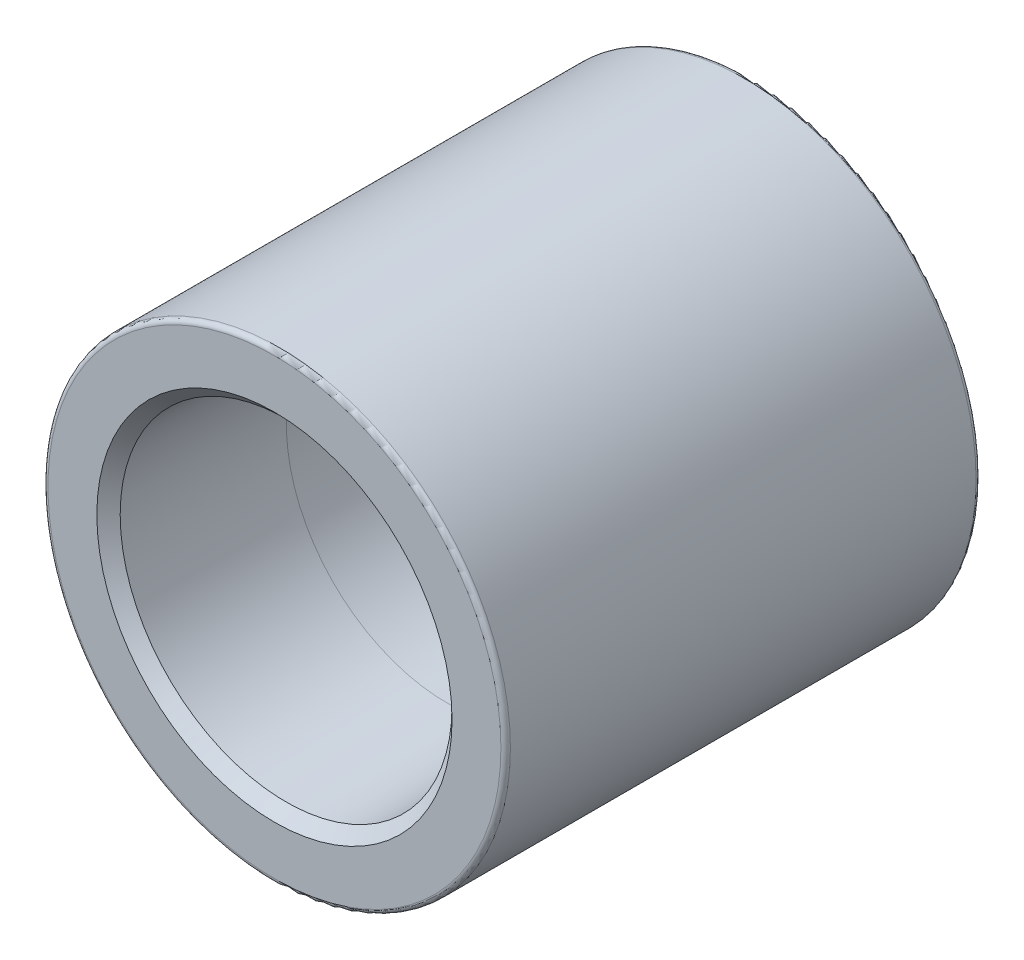
ISO-10303-21;
HEADER;
FILE_DESCRIPTION(('STEP AP214'),'2;1');
FILE_NAME('part.step','',(''),(''),'','','');
FILE_SCHEMA(('AUTOMOTIVE_DESIGN { 1 0 10303 214 1 1 1 1 }'));
ENDSEC;
DATA;
#1=APPLICATION_CONTEXT('core data for automotive mechanical design processes');
#2=APPLICATION_PROTOCOL_DEFINITION('international standard','automotive_design',2000,#1);
#3=PRODUCT_CONTEXT('',#1,'mechanical');
#4=PRODUCT('Part','Part','',(#3));
#5=PRODUCT_RELATED_PRODUCT_CATEGORY('part','',(#4));
#6=PRODUCT_DEFINITION_FORMATION('','',#4);
#7=PRODUCT_DEFINITION_CONTEXT('part definition',#1,'design');
#8=PRODUCT_DEFINITION('design','',#6,#7);
#9=PRODUCT_DEFINITION_SHAPE('','',#8);
#10=(LENGTH_UNIT() NAMED_UNIT(*) SI_UNIT(.MILLI.,.METRE.));
#11=(NAMED_UNIT(*) PLANE_ANGLE_UNIT() SI_UNIT($,.RADIAN.));
#12=(NAMED_UNIT(*) SI_UNIT($,.STERADIAN.) SOLID_ANGLE_UNIT());
#13=UNCERTAINTY_MEASURE_WITH_UNIT(LENGTH_MEASURE(1.E-05),#10,'distance_accuracy_value','');
#14=(GEOMETRIC_REPRESENTATION_CONTEXT(3) GLOBAL_UNCERTAINTY_ASSIGNED_CONTEXT((#13)) GLOBAL_UNIT_ASSIGNED_CONTEXT((#10,
#11,#12)) REPRESENTATION_CONTEXT('',''));
#15=CARTESIAN_POINT('',(0.,0.,0.));
#16=DIRECTION('',(0.,0.,1.));
#17=DIRECTION('',(1.,0.,0.));
#18=AXIS2_PLACEMENT_3D('',#15,#16,#17);
#19=CARTESIAN_POINT('',(0.,0.,19.05));
#20=DIRECTION('',(0.,0.,-1.));
#21=DIRECTION('',(-1.,0.,0.));
#22=AXIS2_PLACEMENT_3D('',#19,#20,#21);
#23=CYLINDRICAL_SURFACE('',#22,18.542);
#24=CARTESIAN_POINT('',(0.,0.,-18.669));
#25=DIRECTION('',(0.,0.,1.));
#26=DIRECTION('',(1.,0.,0.));
#27=AXIS2_PLACEMENT_3D('',#24,#25,#26);
#28=CIRCLE('',#27,18.542);
#29=CARTESIAN_POINT('',(-18.542,0.,-18.669));
#30=VERTEX_POINT('',#29);
#31=EDGE_CURVE('E52',#30,#30,#28,.T.);
#32=CARTESIAN_POINT('',(0.,0.,18.669));
#33=DIRECTION('',(0.,0.,1.));
#34=DIRECTION('',(1.,0.,0.));
#35=AXIS2_PLACEMENT_3D('',#32,#33,#34);
#36=CIRCLE('',#35,18.542);
#37=CARTESIAN_POINT('',(-18.542,0.,18.669));
#38=VERTEX_POINT('',#37);
#39=EDGE_CURVE('E57',#38,#38,#36,.F.);
#40=CARTESIAN_POINT('',(-18.542,0.,-18.669));
#41=CARTESIAN_POINT('',(-18.542,0.,-18.2800625));
#42=CARTESIAN_POINT('',(-18.542,0.,-17.891125));
#43=CARTESIAN_POINT('',(-18.542,0.,-17.11325));
#44=CARTESIAN_POINT('',(-18.542,0.,-16.7243125));
#45=CARTESIAN_POINT('',(-18.542,0.,-15.9464375));
#46=CARTESIAN_POINT('',(-18.542,0.,-15.5575));
#47=CARTESIAN_POINT('',(-18.542,0.,-14.779625));
#48=CARTESIAN_POINT('',(-18.542,0.,-14.3906875));
#49=CARTESIAN_POINT('',(-18.542,0.,-13.6128125));
#50=CARTESIAN_POINT('',(-18.542,0.,-13.223875));
#51=CARTESIAN_POINT('',(-18.542,0.,-12.446));
#52=CARTESIAN_POINT('',(-18.542,0.,-12.0570625));
#53=CARTESIAN_POINT('',(-18.542,0.,-11.2791875));
#54=CARTESIAN_POINT('',(-18.542,0.,-10.89025));
#55=CARTESIAN_POINT('',(-18.542,0.,-10.112375));
#56=CARTESIAN_POINT('',(-18.542,0.,-9.72343750000001));
#57=CARTESIAN_POINT('',(-18.542,0.,-8.94556250000001));
#58=CARTESIAN_POINT('',(-18.542,0.,-8.55662500000001));
#59=CARTESIAN_POINT('',(-18.542,0.,-7.77875000000001));
#60=CARTESIAN_POINT('',(-18.542,0.,-7.38981250000001));
#61=CARTESIAN_POINT('',(-18.542,0.,-6.61193750000001));
#62=CARTESIAN_POINT('',(-18.542,0.,-6.22300000000001));
#63=CARTESIAN_POINT('',(-18.542,0.,-5.44512500000001));
#64=CARTESIAN_POINT('',(-18.542,0.,-5.05618750000001));
#65=CARTESIAN_POINT('',(-18.542,0.,-4.27831250000001));
#66=CARTESIAN_POINT('',(-18.542,0.,-3.88937500000001));
#67=CARTESIAN_POINT('',(-18.542,0.,-3.11150000000001));
#68=CARTESIAN_POINT('',(-18.542,0.,-2.72256250000001));
#69=CARTESIAN_POINT('',(-18.542,0.,-1.94468750000001));
#70=CARTESIAN_POINT('',(-18.542,0.,-1.55575));
#71=CARTESIAN_POINT('',(-18.542,0.,-0.777875000000003));
#72=CARTESIAN_POINT('',(-18.542,0.,-0.388937500000003));
#73=CARTESIAN_POINT('',(-18.542,0.,0.388937499999996));
#74=CARTESIAN_POINT('',(-18.542,0.,0.777874999999996));
#75=CARTESIAN_POINT('',(-18.542,0.,1.55575));
#76=CARTESIAN_POINT('',(-18.542,0.,1.9446875));
#77=CARTESIAN_POINT('',(-18.542,0.,2.7225625));
#78=CARTESIAN_POINT('',(-18.542,0.,3.1115));
#79=CARTESIAN_POINT('',(-18.542,0.,3.889375));
#80=CARTESIAN_POINT('',(-18.542,0.,4.2783125));
#81=CARTESIAN_POINT('',(-18.542,0.,5.0561875));
#82=CARTESIAN_POINT('',(-18.542,0.,5.445125));
#83=CARTESIAN_POINT('',(-18.542,0.,6.223));
#84=CARTESIAN_POINT('',(-18.542,0.,6.6119375));
#85=CARTESIAN_POINT('',(-18.542,0.,7.3898125));
#86=CARTESIAN_POINT('',(-18.542,0.,7.77875));
#87=CARTESIAN_POINT('',(-18.542,0.,8.556625));
#88=CARTESIAN_POINT('',(-18.542,0.,8.9455625));
#89=CARTESIAN_POINT('',(-18.542,0.,9.7234375));
#90=CARTESIAN_POINT('',(-18.542,0.,10.112375));
#91=CARTESIAN_POINT('',(-18.542,0.,10.89025));
#92=CARTESIAN_POINT('',(-18.542,0.,11.2791875));
#93=CARTESIAN_POINT('',(-18.542,0.,12.0570625));
#94=CARTESIAN_POINT('',(-18.542,0.,12.446));
#95=CARTESIAN_POINT('',(-18.542,0.,13.223875));
#96=CARTESIAN_POINT('',(-18.542,0.,13.6128125));
#97=CARTESIAN_POINT('',(-18.542,0.,14.3906875));
#98=CARTESIAN_POINT('',(-18.542,0.,14.779625));
#99=CARTESIAN_POINT('',(-18.542,0.,15.5575));
#100=CARTESIAN_POINT('',(-18.542,0.,15.9464375));
#101=CARTESIAN_POINT('',(-18.542,0.,16.7243125));
#102=CARTESIAN_POINT('',(-18.542,0.,17.11325));
#103=CARTESIAN_POINT('',(-18.542,0.,17.891125));
#104=CARTESIAN_POINT('',(-18.542,0.,18.2800625));
#105=CARTESIAN_POINT('',(-18.542,0.,18.669));
#106=B_SPLINE_CURVE_WITH_KNOTS('',3,(#40,#41,#42,#43,#44,#45,#46,#47,#48,#49,#50,#51,#52,#53,
#54,#55,#56,#57,#58,#59,#60,#61,#62,#63,#64,#65,#66,#67,#68,#69,#70,#71,#72,#73,#74,#75,#76,#77,
#78,#79,#80,#81,#82,#83,#84,#85,#86,#87,#88,#89,#90,#91,#92,#93,#94,#95,#96,#97,#98,#99,#100,
#101,#102,#103,#104,#105),.UNSPECIFIED.,.F.,.F.,(4,2,2,2,2,2,2,2,2,2,2,2,2,2,2,2,2,2,2,2,2,2,2,
2,2,2,2,2,2,2,2,2,4),(0.,1.1668125,2.333625,3.5004375,4.66725,5.8340625,7.000875,8.1676875,
9.3345,10.5013125,11.668125,12.8349375,14.00175,15.1685625,16.335375,17.5021875,18.669,
19.8358125,21.002625,22.1694375,23.33625,24.5030625,25.669875,26.8366875,28.0035,29.1703125,
30.337125,31.5039375,32.67075,33.8375625,35.004375,36.1711875,37.338),.UNSPECIFIED.);
#107=EDGE_CURVE('BSEAM39',#30,#38,#106,.T.);
#108=ORIENTED_EDGE('',*,*,#31,.T.);
#109=ORIENTED_EDGE('',*,*,#39,.T.);
#110=ORIENTED_EDGE('',*,*,#107,.T.);
#111=ORIENTED_EDGE('',*,*,#107,.F.);
#112=EDGE_LOOP('',(#108,#110,#109,#111));
#113=FACE_BOUND('',#112,.T.);
#114=ADVANCED_FACE('F39',(#113),#23,.T.);
#115=CARTESIAN_POINT('',(0.,0.,19.05));
#116=DIRECTION('',(0.,0.,1.));
#117=DIRECTION('',(1.,0.,0.));
#118=AXIS2_PLACEMENT_3D('',#115,#116,#117);
#119=PLANE('',#118);
#120=CARTESIAN_POINT('',(0.,0.,19.05));
#121=DIRECTION('',(0.,0.,1.));
#122=DIRECTION('',(1.,0.,0.));
#123=AXIS2_PLACEMENT_3D('',#120,#121,#122);
#124=CIRCLE('',#123,18.161);
#125=CARTESIAN_POINT('',(18.161,0.,19.05));
#126=VERTEX_POINT('',#125);
#127=EDGE_CURVE('E10',#126,#126,#124,.T.);
#128=ORIENTED_EDGE('',*,*,#127,.T.);
#129=EDGE_LOOP('',(#128));
#130=FACE_BOUND('',#129,.T.);
#131=CARTESIAN_POINT('',(0.,0.,19.05));
#132=DIRECTION('',(0.,0.,1.));
#133=DIRECTION('',(1.,0.,0.));
#134=AXIS2_PLACEMENT_3D('',#131,#132,#133);
#135=CIRCLE('',#134,14.2421428571429);
#136=CARTESIAN_POINT('',(14.2421428571429,0.,19.05));
#137=VERTEX_POINT('',#136);
#138=EDGE_CURVE('E68',#137,#137,#135,.T.);
#139=ORIENTED_EDGE('',*,*,#138,.F.);
#140=EDGE_LOOP('',(#139));
#141=FACE_BOUND('',#140,.T.);
#142=ADVANCED_FACE('F109',(#130,#141),#119,.T.);
#143=CARTESIAN_POINT('',(0.,0.,-19.05));
#144=DIRECTION('',(0.,0.,1.));
#145=DIRECTION('',(1.,0.,0.));
#146=AXIS2_PLACEMENT_3D('',#143,#144,#145);
#147=PLANE('',#146);
#148=CARTESIAN_POINT('',(0.,0.,-19.05));
#149=DIRECTION('',(0.,0.,1.));
#150=DIRECTION('',(1.,0.,0.));
#151=AXIS2_PLACEMENT_3D('',#148,#149,#150);
#152=CIRCLE('',#151,18.161);
#153=CARTESIAN_POINT('',(18.161,0.,-19.05));
#154=VERTEX_POINT('',#153);
#155=EDGE_CURVE('E47',#154,#154,#152,.F.);
#156=ORIENTED_EDGE('',*,*,#155,.T.);
#157=EDGE_LOOP('',(#156));
#158=FACE_BOUND('',#157,.T.);
#159=CARTESIAN_POINT('',(1.33025439009923E-13,0.,-19.05));
#160=DIRECTION('',(0.,0.,-1.));
#161=DIRECTION('',(-1.,0.,0.));
#162=AXIS2_PLACEMENT_3D('',#159,#160,#161);
#163=CIRCLE('',#162,14.2421428571429);
#164=CARTESIAN_POINT('',(-14.2421428571427,0.,-19.0500000000001));
#165=VERTEX_POINT('',#164);
#166=EDGE_CURVE('E69',#165,#165,#163,.T.);
#167=ORIENTED_EDGE('',*,*,#166,.F.);
#168=EDGE_LOOP('',(#167));
#169=FACE_BOUND('',#168,.T.);
#170=ADVANCED_FACE('F104',(#158,#169),#147,.F.);
#171=CARTESIAN_POINT('',(0.,0.,19.05));
#172=DIRECTION('',(0.,0.,1.));
#173=DIRECTION('',(1.,0.,0.));
#174=AXIS2_PLACEMENT_3D('',#171,#172,#173);
#175=CONICAL_SURFACE('',#174,14.2421428571429,0.78539816339745);
#176=ORIENTED_EDGE('',*,*,#138,.T.);
#177=EDGE_LOOP('',(#176));
#178=FACE_BOUND('',#177,.T.);
#179=CARTESIAN_POINT('',(0.,0.,18.1137055271794));
#180=DIRECTION('',(0.,0.,1.));
#181=DIRECTION('',(1.,0.,0.));
#182=AXIS2_PLACEMENT_3D('',#179,#180,#181);
#183=CIRCLE('',#182,13.3058483843223);
#184=CARTESIAN_POINT('',(13.3058483843223,0.,18.1137055271794));
#185=VERTEX_POINT('',#184);
#186=EDGE_CURVE('E63',#185,#185,#183,.T.);
#187=ORIENTED_EDGE('',*,*,#186,.F.);
#188=EDGE_LOOP('',(#187));
#189=FACE_BOUND('',#188,.T.);
#190=ADVANCED_FACE('F94',(#178,#189),#175,.F.);
#191=CARTESIAN_POINT('',(0.,0.,19.05));
#192=DIRECTION('',(0.,0.,1.));
#193=DIRECTION('',(1.,0.,0.));
#194=AXIS2_PLACEMENT_3D('',#191,#192,#193);
#195=CONICAL_SURFACE('',#194,13.335,0.0311250383272323);
#196=ORIENTED_EDGE('',*,*,#186,.T.);
#197=EDGE_LOOP('',(#196));
#198=FACE_BOUND('',#197,.T.);
#199=CARTESIAN_POINT('',(0.,0.,5.18922));
#200=DIRECTION('',(0.,0.,1.));
#201=DIRECTION('',(1.,0.,0.));
#202=AXIS2_PLACEMENT_3D('',#199,#200,#201);
#203=CIRCLE('',#202,12.9034433228188);
#204=CARTESIAN_POINT('',(12.9034433228188,0.,5.18922));
#205=VERTEX_POINT('',#204);
#206=EDGE_CURVE('E83',#205,#205,#203,.T.);
#207=ORIENTED_EDGE('',*,*,#206,.F.);
#208=EDGE_LOOP('',(#207));
#209=FACE_BOUND('',#208,.T.);
#210=ADVANCED_FACE('F91',(#198,#209),#195,.F.);
#211=CARTESIAN_POINT('',(1.33025439009923E-13,0.,-19.05));
#212=DIRECTION('',(0.,0.,-1.));
#213=DIRECTION('',(-1.,0.,0.));
#214=AXIS2_PLACEMENT_3D('',#211,#212,#213);
#215=CONICAL_SURFACE('',#214,14.2421428571429,0.78539816339745);
#216=ORIENTED_EDGE('',*,*,#166,.T.);
#217=EDGE_LOOP('',(#216));
#218=FACE_BOUND('',#217,.T.);
#219=CARTESIAN_POINT('',(1.26487329650893E-13,0.,-18.1137055271794));
#220=DIRECTION('',(0.,0.,-1.));
#221=DIRECTION('',(-1.,0.,0.));
#222=AXIS2_PLACEMENT_3D('',#219,#220,#221);
#223=CIRCLE('',#222,13.3058483843223);
#224=CARTESIAN_POINT('',(-13.3058483843221,0.,-18.1137055271795));
#225=VERTEX_POINT('',#224);
#226=EDGE_CURVE('E64',#225,#225,#223,.T.);
#227=ORIENTED_EDGE('',*,*,#226,.F.);
#228=EDGE_LOOP('',(#227));
#229=FACE_BOUND('',#228,.T.);
#230=ADVANCED_FACE('F93',(#218,#229),#215,.F.);
#231=CARTESIAN_POINT('',(1.33025439009923E-13,0.,-19.05));
#232=DIRECTION('',(0.,0.,-1.));
#233=DIRECTION('',(-1.,0.,0.));
#234=AXIS2_PLACEMENT_3D('',#231,#232,#233);
#235=CONICAL_SURFACE('',#234,13.335,0.0311250383272323);
#236=ORIENTED_EDGE('',*,*,#226,.T.);
#237=EDGE_LOOP('',(#236));
#238=FACE_BOUND('',#237,.T.);
#239=CARTESIAN_POINT('',(0.,0.,-5.18922));
#240=DIRECTION('',(0.,0.,-1.));
#241=DIRECTION('',(-1.,0.,0.));
#242=AXIS2_PLACEMENT_3D('',#239,#240,#241);
#243=CIRCLE('',#242,12.9034433228188);
#244=CARTESIAN_POINT('',(-12.9034433228188,0.,-5.18922000000009));
#245=VERTEX_POINT('',#244);
#246=EDGE_CURVE('E79',#245,#245,#243,.F.);
#247=ORIENTED_EDGE('',*,*,#246,.T.);
#248=EDGE_LOOP('',(#247));
#249=FACE_BOUND('',#248,.T.);
#250=ADVANCED_FACE('F101',(#238,#249),#235,.F.);
#251=CARTESIAN_POINT('',(0.,0.,-18.669));
#252=DIRECTION('',(0.,0.,1.));
#253=DIRECTION('',(1.,0.,0.));
#254=AXIS2_PLACEMENT_3D('',#251,#252,#253);
#255=TOROIDAL_SURFACE('',#254,18.161,0.381);
#256=ORIENTED_EDGE('',*,*,#155,.F.);
#257=EDGE_LOOP('',(#256));
#258=FACE_BOUND('',#257,.T.);
#259=ORIENTED_EDGE('',*,*,#31,.F.);
#260=EDGE_LOOP('',(#259));
#261=FACE_BOUND('',#260,.T.);
#262=ADVANCED_FACE('F117',(#258,#261),#255,.T.);
#263=CARTESIAN_POINT('',(0.,0.,18.669));
#264=DIRECTION('',(0.,0.,1.));
#265=DIRECTION('',(1.,0.,0.));
#266=AXIS2_PLACEMENT_3D('',#263,#264,#265);
#267=TOROIDAL_SURFACE('',#266,18.161,0.381);
#268=ORIENTED_EDGE('',*,*,#39,.F.);
#269=EDGE_LOOP('',(#268));
#270=FACE_BOUND('',#269,.T.);
#271=ORIENTED_EDGE('',*,*,#127,.F.);
#272=EDGE_LOOP('',(#271));
#273=FACE_BOUND('',#272,.T.);
#274=ADVANCED_FACE('F41',(#270,#273),#267,.T.);
#275=CARTESIAN_POINT('',(0.,0.,-19.0500000000001));
#276=DIRECTION('',(0.,0.,1.));
#277=DIRECTION('',(1.,0.,0.));
#278=AXIS2_PLACEMENT_3D('',#275,#276,#277);
#279=CYLINDRICAL_SURFACE('',#278,12.9034433228188);
#280=ORIENTED_EDGE('',*,*,#206,.T.);
#281=EDGE_LOOP('',(#280));
#282=FACE_BOUND('',#281,.T.);
#283=ORIENTED_EDGE('',*,*,#246,.F.);
#284=EDGE_LOOP('',(#283));
#285=FACE_BOUND('',#284,.T.);
#286=ADVANCED_FACE('F88',(#282,#285),#279,.F.);
#287=CLOSED_SHELL('',(#114,#142,#170,#190,#210,#230,#250,#262,#274,#286));
#288=MANIFOLD_SOLID_BREP('B2',#287);
#289=ADVANCED_BREP_SHAPE_REPRESENTATION('',(#18,#288),#14);
#290=SHAPE_DEFINITION_REPRESENTATION(#9,#289);
ENDSEC;
END-ISO-10303-21;
